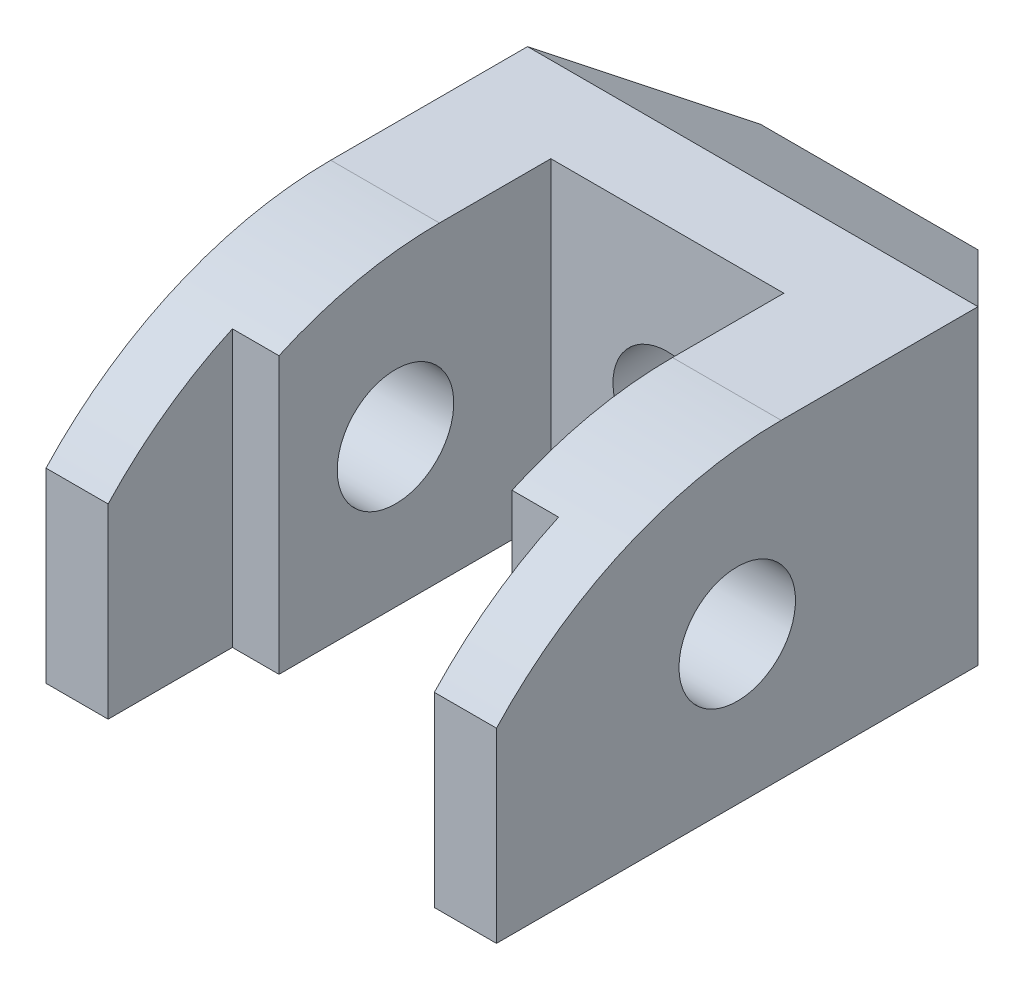
ISO-10303-21;
HEADER;
FILE_DESCRIPTION(('STEP AP214'),'2;1');
FILE_NAME('part.step','',(''),(''),'','','');
FILE_SCHEMA(('AUTOMOTIVE_DESIGN { 1 0 10303 214 1 1 1 1 }'));
ENDSEC;
DATA;
#1=APPLICATION_CONTEXT('core data for automotive mechanical design processes');
#2=APPLICATION_PROTOCOL_DEFINITION('international standard','automotive_design',2000,#1);
#3=PRODUCT_CONTEXT('',#1,'mechanical');
#4=PRODUCT('Part','Part','',(#3));
#5=PRODUCT_RELATED_PRODUCT_CATEGORY('part','',(#4));
#6=PRODUCT_DEFINITION_FORMATION('','',#4);
#7=PRODUCT_DEFINITION_CONTEXT('part definition',#1,'design');
#8=PRODUCT_DEFINITION('design','',#6,#7);
#9=PRODUCT_DEFINITION_SHAPE('','',#8);
#10=(LENGTH_UNIT() NAMED_UNIT(*) SI_UNIT(.MILLI.,.METRE.));
#11=(NAMED_UNIT(*) PLANE_ANGLE_UNIT() SI_UNIT($,.RADIAN.));
#12=(NAMED_UNIT(*) SI_UNIT($,.STERADIAN.) SOLID_ANGLE_UNIT());
#13=UNCERTAINTY_MEASURE_WITH_UNIT(LENGTH_MEASURE(1.E-05),#10,'distance_accuracy_value','');
#14=(GEOMETRIC_REPRESENTATION_CONTEXT(3) GLOBAL_UNCERTAINTY_ASSIGNED_CONTEXT((#13)) GLOBAL_UNIT_ASSIGNED_CONTEXT((#10,
#11,#12)) REPRESENTATION_CONTEXT('',''));
#15=CARTESIAN_POINT('',(0.,0.,0.));
#16=DIRECTION('',(0.,0.,1.));
#17=DIRECTION('',(1.,0.,0.));
#18=AXIS2_PLACEMENT_3D('',#15,#16,#17);
#19=CARTESIAN_POINT('',(29.,-29.,-5.66060555964671));
#20=DIRECTION('',(-1.,0.,0.));
#21=DIRECTION('',(0.,0.,1.));
#22=AXIS2_PLACEMENT_3D('',#19,#20,#21);
#23=CYLINDRICAL_SURFACE('',#22,50.);
#24=DIRECTION('',(-1.,0.,0.));
#25=VECTOR('',#24,1.);
#26=CARTESIAN_POINT('',(29.,5.,31.));
#27=LINE('',#26,#25);
#28=CARTESIAN_POINT('',(-21.,4.99999999999999,31.));
#29=VERTEX_POINT('',#28);
#30=CARTESIAN_POINT('',(-29.,5.,31.));
#31=VERTEX_POINT('',#30);
#32=EDGE_CURVE('E196',#29,#31,#27,.T.);
#33=ORIENTED_EDGE('',*,*,#32,.F.);
#34=CARTESIAN_POINT('',(-21.,-29.,-5.66060555964671));
#35=DIRECTION('',(-1.,0.,0.));
#36=DIRECTION('',(0.,0.,1.));
#37=AXIS2_PLACEMENT_3D('',#34,#35,#36);
#38=CIRCLE('',#37,50.);
#39=CARTESIAN_POINT('',(-21.,16.5317403347236,15.));
#40=VERTEX_POINT('',#39);
#41=EDGE_CURVE('E166',#29,#40,#38,.T.);
#42=ORIENTED_EDGE('',*,*,#41,.T.);
#43=DIRECTION('',(-1.,0.,0.));
#44=VECTOR('',#43,1.);
#45=CARTESIAN_POINT('',(29.,16.5317403347236,15.));
#46=LINE('',#45,#44);
#47=CARTESIAN_POINT('',(-15.,16.5317403347236,15.));
#48=VERTEX_POINT('',#47);
#49=EDGE_CURVE('E237',#40,#48,#46,.F.);
#50=ORIENTED_EDGE('',*,*,#49,.T.);
#51=CARTESIAN_POINT('',(-15.,-29.,-5.66060555964671));
#52=DIRECTION('',(-1.,0.,0.));
#53=DIRECTION('',(0.,0.,1.));
#54=AXIS2_PLACEMENT_3D('',#51,#52,#53);
#55=CIRCLE('',#54,50.);
#56=CARTESIAN_POINT('',(-15.,21.,-5.66060555964671));
#57=VERTEX_POINT('',#56);
#58=EDGE_CURVE('E224',#48,#57,#55,.T.);
#59=ORIENTED_EDGE('',*,*,#58,.T.);
#60=DIRECTION('',(-1.,0.,0.));
#61=VECTOR('',#60,1.);
#62=CARTESIAN_POINT('',(29.,21.,-5.66060555964671));
#63=LINE('',#62,#61);
#64=CARTESIAN_POINT('',(-29.,21.,-5.66060555964671));
#65=VERTEX_POINT('',#64);
#66=EDGE_CURVE('E292',#57,#65,#63,.T.);
#67=ORIENTED_EDGE('',*,*,#66,.T.);
#68=CARTESIAN_POINT('',(-29.,-29.,-5.66060555964671));
#69=DIRECTION('',(1.,0.,0.));
#70=DIRECTION('',(0.,0.,-1.));
#71=AXIS2_PLACEMENT_3D('',#68,#69,#70);
#72=CIRCLE('',#71,50.);
#73=EDGE_CURVE('E273',#65,#31,#72,.T.);
#74=ORIENTED_EDGE('',*,*,#73,.T.);
#75=EDGE_LOOP('',(#33,#42,#50,#59,#67,#74));
#76=FACE_BOUND('',#75,.T.);
#77=ADVANCED_FACE('F42',(#76),#23,.T.);
#78=CARTESIAN_POINT('',(29.,5.,31.));
#79=DIRECTION('',(0.,0.,-1.));
#80=DIRECTION('',(-1.,0.,0.));
#81=AXIS2_PLACEMENT_3D('',#78,#79,#80);
#82=PLANE('',#81);
#83=DIRECTION('',(-1.,0.,0.));
#84=VECTOR('',#83,1.);
#85=CARTESIAN_POINT('',(29.,-19.,31.));
#86=LINE('',#85,#84);
#87=CARTESIAN_POINT('',(-21.,-19.,31.));
#88=VERTEX_POINT('',#87);
#89=CARTESIAN_POINT('',(-29.,-19.,31.));
#90=VERTEX_POINT('',#89);
#91=EDGE_CURVE('E177',#88,#90,#86,.T.);
#92=ORIENTED_EDGE('',*,*,#91,.F.);
#93=DIRECTION('',(0.,1.,0.));
#94=VECTOR('',#93,1.);
#95=CARTESIAN_POINT('',(-21.,-19.,31.));
#96=LINE('',#95,#94);
#97=EDGE_CURVE('E159',#88,#29,#96,.T.);
#98=ORIENTED_EDGE('',*,*,#97,.T.);
#99=ORIENTED_EDGE('',*,*,#32,.T.);
#100=DIRECTION('',(0.,-1.,0.));
#101=VECTOR('',#100,1.);
#102=CARTESIAN_POINT('',(-29.,5.,31.));
#103=LINE('',#102,#101);
#104=EDGE_CURVE('E187',#31,#90,#103,.T.);
#105=ORIENTED_EDGE('',*,*,#104,.T.);
#106=EDGE_LOOP('',(#92,#98,#99,#105));
#107=FACE_BOUND('',#106,.T.);
#108=ADVANCED_FACE('F185',(#107),#82,.F.);
#109=CARTESIAN_POINT('',(29.,0.,0.));
#110=DIRECTION('',(-1.,0.,0.));
#111=DIRECTION('',(0.,0.,1.));
#112=AXIS2_PLACEMENT_3D('',#109,#110,#111);
#113=CYLINDRICAL_SURFACE('',#112,7.5);
#114=CARTESIAN_POINT('',(-15.,0.,0.));
#115=DIRECTION('',(-1.,0.,0.));
#116=DIRECTION('',(0.,0.,1.));
#117=AXIS2_PLACEMENT_3D('',#114,#115,#116);
#118=CIRCLE('',#117,7.5);
#119=CARTESIAN_POINT('',(-15.,0.,7.5));
#120=VERTEX_POINT('',#119);
#121=EDGE_CURVE('E46',#120,#120,#118,.T.);
#122=CARTESIAN_POINT('',(-29.,0.,0.));
#123=DIRECTION('',(1.,0.,0.));
#124=DIRECTION('',(0.,0.,-1.));
#125=AXIS2_PLACEMENT_3D('',#122,#123,#124);
#126=CIRCLE('',#125,7.5);
#127=CARTESIAN_POINT('',(-29.,0.,7.5));
#128=VERTEX_POINT('',#127);
#129=EDGE_CURVE('E268',#128,#128,#126,.T.);
#130=CARTESIAN_POINT('',(-15.,0.,7.5));
#131=CARTESIAN_POINT('',(-15.1458333333333,0.,7.5));
#132=CARTESIAN_POINT('',(-15.2916666666667,0.,7.5));
#133=CARTESIAN_POINT('',(-15.5833333333333,0.,7.5));
#134=CARTESIAN_POINT('',(-15.7291666666667,0.,7.5));
#135=CARTESIAN_POINT('',(-16.0208333333333,0.,7.5));
#136=CARTESIAN_POINT('',(-16.1666666666667,0.,7.5));
#137=CARTESIAN_POINT('',(-16.4583333333333,0.,7.5));
#138=CARTESIAN_POINT('',(-16.6041666666667,0.,7.5));
#139=CARTESIAN_POINT('',(-16.8958333333333,0.,7.5));
#140=CARTESIAN_POINT('',(-17.0416666666667,0.,7.5));
#141=CARTESIAN_POINT('',(-17.3333333333333,0.,7.5));
#142=CARTESIAN_POINT('',(-17.4791666666667,0.,7.5));
#143=CARTESIAN_POINT('',(-17.7708333333333,0.,7.5));
#144=CARTESIAN_POINT('',(-17.9166666666667,0.,7.5));
#145=CARTESIAN_POINT('',(-18.2083333333333,0.,7.5));
#146=CARTESIAN_POINT('',(-18.3541666666667,0.,7.5));
#147=CARTESIAN_POINT('',(-18.6458333333333,0.,7.5));
#148=CARTESIAN_POINT('',(-18.7916666666667,0.,7.5));
#149=CARTESIAN_POINT('',(-19.0833333333333,0.,7.5));
#150=CARTESIAN_POINT('',(-19.2291666666667,0.,7.5));
#151=CARTESIAN_POINT('',(-19.5208333333333,0.,7.5));
#152=CARTESIAN_POINT('',(-19.6666666666667,0.,7.5));
#153=CARTESIAN_POINT('',(-19.9583333333333,0.,7.5));
#154=CARTESIAN_POINT('',(-20.1041666666667,0.,7.5));
#155=CARTESIAN_POINT('',(-20.3958333333333,0.,7.5));
#156=CARTESIAN_POINT('',(-20.5416666666667,0.,7.5));
#157=CARTESIAN_POINT('',(-20.8333333333333,0.,7.5));
#158=CARTESIAN_POINT('',(-20.9791666666667,0.,7.5));
#159=CARTESIAN_POINT('',(-21.2708333333333,0.,7.5));
#160=CARTESIAN_POINT('',(-21.4166666666667,0.,7.5));
#161=CARTESIAN_POINT('',(-21.7083333333333,0.,7.5));
#162=CARTESIAN_POINT('',(-21.8541666666667,0.,7.5));
#163=CARTESIAN_POINT('',(-22.1458333333333,0.,7.5));
#164=CARTESIAN_POINT('',(-22.2916666666667,0.,7.5));
#165=CARTESIAN_POINT('',(-22.5833333333333,0.,7.5));
#166=CARTESIAN_POINT('',(-22.7291666666667,0.,7.5));
#167=CARTESIAN_POINT('',(-23.0208333333333,0.,7.5));
#168=CARTESIAN_POINT('',(-23.1666666666667,0.,7.5));
#169=CARTESIAN_POINT('',(-23.4583333333333,0.,7.5));
#170=CARTESIAN_POINT('',(-23.6041666666667,0.,7.5));
#171=CARTESIAN_POINT('',(-23.8958333333333,0.,7.5));
#172=CARTESIAN_POINT('',(-24.0416666666667,0.,7.5));
#173=CARTESIAN_POINT('',(-24.3333333333333,0.,7.5));
#174=CARTESIAN_POINT('',(-24.4791666666667,0.,7.5));
#175=CARTESIAN_POINT('',(-24.7708333333333,0.,7.5));
#176=CARTESIAN_POINT('',(-24.9166666666667,0.,7.5));
#177=CARTESIAN_POINT('',(-25.2083333333333,0.,7.5));
#178=CARTESIAN_POINT('',(-25.3541666666667,0.,7.5));
#179=CARTESIAN_POINT('',(-25.6458333333333,0.,7.5));
#180=CARTESIAN_POINT('',(-25.7916666666667,0.,7.5));
#181=CARTESIAN_POINT('',(-26.0833333333333,0.,7.5));
#182=CARTESIAN_POINT('',(-26.2291666666667,0.,7.5));
#183=CARTESIAN_POINT('',(-26.5208333333333,0.,7.5));
#184=CARTESIAN_POINT('',(-26.6666666666667,0.,7.5));
#185=CARTESIAN_POINT('',(-26.9583333333333,0.,7.5));
#186=CARTESIAN_POINT('',(-27.1041666666667,0.,7.5));
#187=CARTESIAN_POINT('',(-27.3958333333333,0.,7.5));
#188=CARTESIAN_POINT('',(-27.5416666666667,0.,7.5));
#189=CARTESIAN_POINT('',(-27.8333333333333,0.,7.5));
#190=CARTESIAN_POINT('',(-27.9791666666667,0.,7.5));
#191=CARTESIAN_POINT('',(-28.2708333333333,0.,7.5));
#192=CARTESIAN_POINT('',(-28.4166666666667,0.,7.5));
#193=CARTESIAN_POINT('',(-28.7083333333333,0.,7.5));
#194=CARTESIAN_POINT('',(-28.8541666666667,0.,7.5));
#195=CARTESIAN_POINT('',(-29.,0.,7.5));
#196=B_SPLINE_CURVE_WITH_KNOTS('',3,(#130,#131,#132,#133,#134,#135,#136,#137,#138,#139,#140,
#141,#142,#143,#144,#145,#146,#147,#148,#149,#150,#151,#152,#153,#154,#155,#156,#157,#158,#159,
#160,#161,#162,#163,#164,#165,#166,#167,#168,#169,#170,#171,#172,#173,#174,#175,#176,#177,#178,
#179,#180,#181,#182,#183,#184,#185,#186,#187,#188,#189,#190,#191,#192,#193,#194,#195),
.UNSPECIFIED.,.F.,.F.,(4,2,2,2,2,2,2,2,2,2,2,2,2,2,2,2,2,2,2,2,2,2,2,2,2,2,2,2,2,2,2,2,4),(0.,
0.4375,0.875000000000001,1.3125,1.75,2.1875,2.625,3.0625,3.5,3.9375,4.375,4.8125,5.25,
5.68750000000001,6.12500000000001,6.56250000000001,7.00000000000001,7.43750000000001,
7.87500000000001,8.31250000000001,8.75000000000001,9.18750000000001,9.62500000000001,10.0625,
10.5,10.9375,11.375,11.8125,12.25,12.6875,13.125,13.5625,14.),.UNSPECIFIED.);
#197=EDGE_CURVE('BSEAM432',#120,#128,#196,.T.);
#198=ORIENTED_EDGE('',*,*,#121,.F.);
#199=ORIENTED_EDGE('',*,*,#129,.F.);
#200=ORIENTED_EDGE('',*,*,#197,.T.);
#201=ORIENTED_EDGE('',*,*,#197,.F.);
#202=EDGE_LOOP('',(#198,#200,#199,#201));
#203=FACE_BOUND('',#202,.T.);
#204=ADVANCED_FACE('F432',(#203),#113,.F.);
#205=CARTESIAN_POINT('',(29.,-29.,-5.66060555964671));
#206=DIRECTION('',(1.,0.,0.));
#207=DIRECTION('',(0.,0.,-1.));
#208=AXIS2_PLACEMENT_3D('',#205,#206,#207);
#209=PLANE('',#208);
#210=DIRECTION('',(0.,1.,0.));
#211=VECTOR('',#210,1.);
#212=CARTESIAN_POINT('',(29.,-19.,-31.));
#213=LINE('',#212,#211);
#214=CARTESIAN_POINT('',(29.,-19.,-31.));
#215=VERTEX_POINT('',#214);
#216=CARTESIAN_POINT('',(29.,21.,-31.));
#217=VERTEX_POINT('',#216);
#218=EDGE_CURVE('E255',#215,#217,#213,.T.);
#219=ORIENTED_EDGE('',*,*,#218,.T.);
#220=DIRECTION('',(0.,0.,1.));
#221=VECTOR('',#220,1.);
#222=CARTESIAN_POINT('',(29.,21.,-31.));
#223=LINE('',#222,#221);
#224=CARTESIAN_POINT('',(29.,21.,-5.66060555964671));
#225=VERTEX_POINT('',#224);
#226=EDGE_CURVE('E289',#217,#225,#223,.T.);
#227=ORIENTED_EDGE('',*,*,#226,.T.);
#228=CARTESIAN_POINT('',(29.,-29.,-5.66060555964671));
#229=DIRECTION('',(1.,0.,0.));
#230=DIRECTION('',(0.,0.,-1.));
#231=AXIS2_PLACEMENT_3D('',#228,#229,#230);
#232=CIRCLE('',#231,50.);
#233=CARTESIAN_POINT('',(29.,5.,31.));
#234=VERTEX_POINT('',#233);
#235=EDGE_CURVE('E277',#225,#234,#232,.T.);
#236=ORIENTED_EDGE('',*,*,#235,.T.);
#237=DIRECTION('',(0.,-1.,0.));
#238=VECTOR('',#237,1.);
#239=CARTESIAN_POINT('',(29.,5.,31.));
#240=LINE('',#239,#238);
#241=CARTESIAN_POINT('',(29.,-19.,31.));
#242=VERTEX_POINT('',#241);
#243=EDGE_CURVE('E281',#234,#242,#240,.T.);
#244=ORIENTED_EDGE('',*,*,#243,.T.);
#245=DIRECTION('',(0.,0.,-1.));
#246=VECTOR('',#245,1.);
#247=CARTESIAN_POINT('',(29.,-19.,31.));
#248=LINE('',#247,#246);
#249=EDGE_CURVE('E285',#242,#215,#248,.T.);
#250=ORIENTED_EDGE('',*,*,#249,.T.);
#251=EDGE_LOOP('',(#219,#227,#236,#244,#250));
#252=FACE_BOUND('',#251,.T.);
#253=CARTESIAN_POINT('',(29.,0.,0.));
#254=DIRECTION('',(1.,0.,0.));
#255=DIRECTION('',(0.,0.,-1.));
#256=AXIS2_PLACEMENT_3D('',#253,#254,#255);
#257=CIRCLE('',#256,7.5);
#258=CARTESIAN_POINT('',(29.,0.,7.5));
#259=VERTEX_POINT('',#258);
#260=EDGE_CURVE('E269',#259,#259,#257,.T.);
#261=ORIENTED_EDGE('',*,*,#260,.F.);
#262=EDGE_LOOP('',(#261));
#263=FACE_BOUND('',#262,.T.);
#264=ADVANCED_FACE('F335',(#252,#263),#209,.T.);
#265=CARTESIAN_POINT('',(-29.,-29.,-5.66060555964671));
#266=DIRECTION('',(1.,0.,0.));
#267=DIRECTION('',(0.,0.,-1.));
#268=AXIS2_PLACEMENT_3D('',#265,#266,#267);
#269=PLANE('',#268);
#270=DIRECTION('',(0.,0.,1.));
#271=VECTOR('',#270,1.);
#272=CARTESIAN_POINT('',(-29.,21.,-31.));
#273=LINE('',#272,#271);
#274=CARTESIAN_POINT('',(-29.,21.,-31.));
#275=VERTEX_POINT('',#274);
#276=EDGE_CURVE('E282',#275,#65,#273,.T.);
#277=ORIENTED_EDGE('',*,*,#276,.F.);
#278=DIRECTION('',(0.,1.,0.));
#279=VECTOR('',#278,1.);
#280=CARTESIAN_POINT('',(-29.,-19.,-31.));
#281=LINE('',#280,#279);
#282=CARTESIAN_POINT('',(-29.,-19.,-31.));
#283=VERTEX_POINT('',#282);
#284=EDGE_CURVE('E252',#283,#275,#281,.T.);
#285=ORIENTED_EDGE('',*,*,#284,.F.);
#286=DIRECTION('',(0.,0.,-1.));
#287=VECTOR('',#286,1.);
#288=CARTESIAN_POINT('',(-29.,-19.,31.));
#289=LINE('',#288,#287);
#290=EDGE_CURVE('E298',#90,#283,#289,.T.);
#291=ORIENTED_EDGE('',*,*,#290,.F.);
#292=ORIENTED_EDGE('',*,*,#104,.F.);
#293=ORIENTED_EDGE('',*,*,#73,.F.);
#294=EDGE_LOOP('',(#277,#285,#291,#292,#293));
#295=FACE_BOUND('',#294,.T.);
#296=ORIENTED_EDGE('',*,*,#129,.T.);
#297=EDGE_LOOP('',(#296));
#298=FACE_BOUND('',#297,.T.);
#299=ADVANCED_FACE('F328',(#295,#298),#269,.F.);
#300=CARTESIAN_POINT('',(15.,21.,-5.66060555964671));
#301=VERTEX_POINT('',#300);
#302=EDGE_CURVE('E304',#225,#301,#63,.T.);
#303=ORIENTED_EDGE('',*,*,#302,.T.);
#304=CARTESIAN_POINT('',(15.,-29.,-5.66060555964671));
#305=DIRECTION('',(1.,0.,0.));
#306=DIRECTION('',(0.,0.,-1.));
#307=AXIS2_PLACEMENT_3D('',#304,#305,#306);
#308=CIRCLE('',#307,50.);
#309=CARTESIAN_POINT('',(15.,16.5317403347236,15.));
#310=VERTEX_POINT('',#309);
#311=EDGE_CURVE('E60',#301,#310,#308,.T.);
#312=ORIENTED_EDGE('',*,*,#311,.T.);
#313=DIRECTION('',(-1.,0.,0.));
#314=VECTOR('',#313,1.);
#315=CARTESIAN_POINT('',(29.,16.5317403347236,15.));
#316=LINE('',#315,#314);
#317=CARTESIAN_POINT('',(21.,16.5317403347236,15.));
#318=VERTEX_POINT('',#317);
#319=EDGE_CURVE('E234',#310,#318,#316,.F.);
#320=ORIENTED_EDGE('',*,*,#319,.T.);
#321=CARTESIAN_POINT('',(21.,-29.,-5.66060555964671));
#322=DIRECTION('',(1.,0.,0.));
#323=DIRECTION('',(0.,0.,-1.));
#324=AXIS2_PLACEMENT_3D('',#321,#322,#323);
#325=CIRCLE('',#324,50.);
#326=CARTESIAN_POINT('',(21.,4.99999999999999,31.));
#327=VERTEX_POINT('',#326);
#328=EDGE_CURVE('E230',#318,#327,#325,.T.);
#329=ORIENTED_EDGE('',*,*,#328,.T.);
#330=EDGE_CURVE('E202',#234,#327,#27,.T.);
#331=ORIENTED_EDGE('',*,*,#330,.F.);
#332=ORIENTED_EDGE('',*,*,#235,.F.);
#333=EDGE_LOOP('',(#303,#312,#320,#329,#331,#332));
#334=FACE_BOUND('',#333,.T.);
#335=ADVANCED_FACE('F44',(#334),#23,.T.);
#336=ORIENTED_EDGE('',*,*,#330,.T.);
#337=DIRECTION('',(0.,1.,0.));
#338=VECTOR('',#337,1.);
#339=CARTESIAN_POINT('',(21.,-19.,31.));
#340=LINE('',#339,#338);
#341=CARTESIAN_POINT('',(21.,-19.,31.));
#342=VERTEX_POINT('',#341);
#343=EDGE_CURVE('E171',#342,#327,#340,.T.);
#344=ORIENTED_EDGE('',*,*,#343,.F.);
#345=EDGE_CURVE('E190',#242,#342,#86,.T.);
#346=ORIENTED_EDGE('',*,*,#345,.F.);
#347=ORIENTED_EDGE('',*,*,#243,.F.);
#348=EDGE_LOOP('',(#336,#344,#346,#347));
#349=FACE_BOUND('',#348,.T.);
#350=ADVANCED_FACE('F342',(#349),#82,.F.);
#351=CARTESIAN_POINT('',(29.,-19.,31.));
#352=DIRECTION('',(0.,1.,0.));
#353=DIRECTION('',(0.,0.,1.));
#354=AXIS2_PLACEMENT_3D('',#351,#352,#353);
#355=PLANE('',#354);
#356=DIRECTION('',(-1.,0.,0.));
#357=VECTOR('',#356,1.);
#358=CARTESIAN_POINT('',(-21.,-19.,15.));
#359=LINE('',#358,#357);
#360=CARTESIAN_POINT('',(-15.,-19.,15.));
#361=VERTEX_POINT('',#360);
#362=CARTESIAN_POINT('',(-21.,-19.,15.));
#363=VERTEX_POINT('',#362);
#364=EDGE_CURVE('E172',#361,#363,#359,.T.);
#365=ORIENTED_EDGE('',*,*,#364,.T.);
#366=DIRECTION('',(0.,0.,1.));
#367=VECTOR('',#366,1.);
#368=CARTESIAN_POINT('',(-21.,-19.,31.));
#369=LINE('',#368,#367);
#370=EDGE_CURVE('E163',#363,#88,#369,.T.);
#371=ORIENTED_EDGE('',*,*,#370,.T.);
#372=ORIENTED_EDGE('',*,*,#91,.T.);
#373=ORIENTED_EDGE('',*,*,#290,.T.);
#374=DIRECTION('',(-1.,0.,0.));
#375=VECTOR('',#374,1.);
#376=CARTESIAN_POINT('',(29.,-19.,-31.));
#377=LINE('',#376,#375);
#378=EDGE_CURVE('E191',#215,#283,#377,.T.);
#379=ORIENTED_EDGE('',*,*,#378,.F.);
#380=ORIENTED_EDGE('',*,*,#249,.F.);
#381=ORIENTED_EDGE('',*,*,#345,.T.);
#382=DIRECTION('',(0.,0.,-1.));
#383=VECTOR('',#382,1.);
#384=CARTESIAN_POINT('',(21.,-19.,15.));
#385=LINE('',#384,#383);
#386=CARTESIAN_POINT('',(21.,-19.,15.));
#387=VERTEX_POINT('',#386);
#388=EDGE_CURVE('E182',#342,#387,#385,.T.);
#389=ORIENTED_EDGE('',*,*,#388,.T.);
#390=DIRECTION('',(-1.,0.,0.));
#391=VECTOR('',#390,1.);
#392=CARTESIAN_POINT('',(15.,-19.,15.));
#393=LINE('',#392,#391);
#394=CARTESIAN_POINT('',(15.,-19.,15.));
#395=VERTEX_POINT('',#394);
#396=EDGE_CURVE('E388',#387,#395,#393,.T.);
#397=ORIENTED_EDGE('',*,*,#396,.T.);
#398=DIRECTION('',(0.,0.,-1.));
#399=VECTOR('',#398,1.);
#400=CARTESIAN_POINT('',(15.,-19.,-20.));
#401=LINE('',#400,#399);
#402=CARTESIAN_POINT('',(15.,-19.,-20.));
#403=VERTEX_POINT('',#402);
#404=EDGE_CURVE('E384',#395,#403,#401,.T.);
#405=ORIENTED_EDGE('',*,*,#404,.T.);
#406=DIRECTION('',(-1.,0.,0.));
#407=VECTOR('',#406,1.);
#408=CARTESIAN_POINT('',(-15.,-19.,-20.));
#409=LINE('',#408,#407);
#410=CARTESIAN_POINT('',(-15.,-19.,-20.));
#411=VERTEX_POINT('',#410);
#412=EDGE_CURVE('E380',#403,#411,#409,.T.);
#413=ORIENTED_EDGE('',*,*,#412,.T.);
#414=DIRECTION('',(0.,0.,1.));
#415=VECTOR('',#414,1.);
#416=CARTESIAN_POINT('',(-15.,-19.,15.));
#417=LINE('',#416,#415);
#418=EDGE_CURVE('E377',#411,#361,#417,.T.);
#419=ORIENTED_EDGE('',*,*,#418,.T.);
#420=EDGE_LOOP('',(#365,#371,#372,#373,#379,#380,#381,#389,#397,#405,#413,#419));
#421=FACE_BOUND('',#420,.T.);
#422=ADVANCED_FACE('F175',(#421),#355,.F.);
#423=CARTESIAN_POINT('',(29.,-19.,-31.));
#424=DIRECTION('',(0.,0.866025403784438,0.500000000000001));
#425=DIRECTION('',(0.,-0.500000000000001,0.866025403784438));
#426=AXIS2_PLACEMENT_3D('',#423,#424,#425);
#427=PLANE('',#426);
#428=ORIENTED_EDGE('',*,*,#378,.T.);
#429=DIRECTION('',(0.654653670707978,0.377964473009228,-0.654653670707976));
#430=VECTOR('',#429,1.);
#431=CARTESIAN_POINT('',(-4.14285714285709,-4.64872188014355,-55.8571428571429));
#432=LINE('',#431,#430);
#433=CARTESIAN_POINT('',(-14.,-10.3397459621556,-46.));
#434=VERTEX_POINT('',#433);
#435=EDGE_CURVE('E264',#283,#434,#432,.T.);
#436=ORIENTED_EDGE('',*,*,#435,.T.);
#437=DIRECTION('',(-1.,0.,0.));
#438=VECTOR('',#437,1.);
#439=CARTESIAN_POINT('',(29.,-10.3397459621556,-46.));
#440=LINE('',#439,#438);
#441=CARTESIAN_POINT('',(14.0000000000002,-10.3397459621556,-46.));
#442=VERTEX_POINT('',#441);
#443=EDGE_CURVE('E198',#442,#434,#440,.T.);
#444=ORIENTED_EDGE('',*,*,#443,.F.);
#445=DIRECTION('',(0.654653670707973,-0.37796447300923,0.65465367070798));
#446=VECTOR('',#445,1.);
#447=CARTESIAN_POINT('',(29.,-19.,-31.));
#448=LINE('',#447,#446);
#449=EDGE_CURVE('E251',#442,#215,#448,.T.);
#450=ORIENTED_EDGE('',*,*,#449,.T.);
#451=EDGE_LOOP('',(#428,#436,#444,#450));
#452=FACE_BOUND('',#451,.T.);
#453=ADVANCED_FACE('F321',(#452),#427,.F.);
#454=CARTESIAN_POINT('',(29.,-10.3397459621556,-46.));
#455=DIRECTION('',(0.,0.,1.));
#456=DIRECTION('',(0.,-1.,0.));
#457=AXIS2_PLACEMENT_3D('',#454,#455,#456);
#458=PLANE('',#457);
#459=CARTESIAN_POINT('',(0.,0.,-46.));
#460=DIRECTION('',(0.,0.,-1.));
#461=DIRECTION('',(0.,1.,0.));
#462=AXIS2_PLACEMENT_3D('',#459,#460,#461);
#463=CIRCLE('',#462,7.);
#464=CARTESIAN_POINT('',(0.,6.99999999999999,-46.));
#465=VERTEX_POINT('',#464);
#466=EDGE_CURVE('E243',#465,#465,#463,.T.);
#467=ORIENTED_EDGE('',*,*,#466,.F.);
#468=EDGE_LOOP('',(#467));
#469=FACE_BOUND('',#468,.T.);
#470=ORIENTED_EDGE('',*,*,#443,.T.);
#471=DIRECTION('',(0.,1.,0.));
#472=VECTOR('',#471,1.);
#473=CARTESIAN_POINT('',(-14.,-19.,-46.));
#474=LINE('',#473,#472);
#475=CARTESIAN_POINT('',(-14.,12.3397459621556,-46.));
#476=VERTEX_POINT('',#475);
#477=EDGE_CURVE('E247',#434,#476,#474,.T.);
#478=ORIENTED_EDGE('',*,*,#477,.T.);
#479=DIRECTION('',(-1.,0.,0.));
#480=VECTOR('',#479,1.);
#481=CARTESIAN_POINT('',(29.,12.3397459621556,-46.));
#482=LINE('',#481,#480);
#483=CARTESIAN_POINT('',(14.0000000000002,12.3397459621556,-46.));
#484=VERTEX_POINT('',#483);
#485=EDGE_CURVE('E311',#484,#476,#482,.T.);
#486=ORIENTED_EDGE('',*,*,#485,.F.);
#487=DIRECTION('',(0.,1.,0.));
#488=VECTOR('',#487,1.);
#489=CARTESIAN_POINT('',(14.0000000000002,-19.,-46.));
#490=LINE('',#489,#488);
#491=EDGE_CURVE('E68',#442,#484,#490,.T.);
#492=ORIENTED_EDGE('',*,*,#491,.F.);
#493=EDGE_LOOP('',(#470,#478,#486,#492));
#494=FACE_BOUND('',#493,.T.);
#495=ADVANCED_FACE('F318',(#469,#494),#458,.F.);
#496=CARTESIAN_POINT('',(29.,12.3397459621556,-46.));
#497=DIRECTION('',(0.,-0.866025403784438,0.500000000000001));
#498=DIRECTION('',(0.,-0.500000000000001,-0.866025403784438));
#499=AXIS2_PLACEMENT_3D('',#496,#497,#498);
#500=PLANE('',#499);
#501=ORIENTED_EDGE('',*,*,#485,.T.);
#502=DIRECTION('',(-0.654653670707978,0.377964473009227,0.654653670707976));
#503=VECTOR('',#502,1.);
#504=CARTESIAN_POINT('',(4.4285714285715,1.70000528708962,-64.4285714285714));
#505=LINE('',#504,#503);
#506=EDGE_CURVE('E11',#476,#275,#505,.T.);
#507=ORIENTED_EDGE('',*,*,#506,.T.);
#508=DIRECTION('',(-1.,0.,0.));
#509=VECTOR('',#508,1.);
#510=CARTESIAN_POINT('',(29.,21.,-31.));
#511=LINE('',#510,#509);
#512=EDGE_CURVE('E307',#217,#275,#511,.T.);
#513=ORIENTED_EDGE('',*,*,#512,.F.);
#514=DIRECTION('',(-0.654653670707973,-0.37796447300923,-0.65465367070798));
#515=VECTOR('',#514,1.);
#516=CARTESIAN_POINT('',(20.4285714285714,16.051283406946,-39.5714285714287));
#517=LINE('',#516,#515);
#518=EDGE_CURVE('E52',#217,#484,#517,.T.);
#519=ORIENTED_EDGE('',*,*,#518,.T.);
#520=EDGE_LOOP('',(#501,#507,#513,#519));
#521=FACE_BOUND('',#520,.T.);
#522=ADVANCED_FACE('F419',(#521),#500,.F.);
#523=CARTESIAN_POINT('',(29.,21.,-31.));
#524=DIRECTION('',(0.,-1.,0.));
#525=DIRECTION('',(0.,0.,-1.));
#526=AXIS2_PLACEMENT_3D('',#523,#524,#525);
#527=PLANE('',#526);
#528=ORIENTED_EDGE('',*,*,#66,.F.);
#529=DIRECTION('',(0.,0.,1.));
#530=VECTOR('',#529,1.);
#531=CARTESIAN_POINT('',(-15.,21.,15.));
#532=LINE('',#531,#530);
#533=CARTESIAN_POINT('',(-15.,21.,-20.));
#534=VERTEX_POINT('',#533);
#535=EDGE_CURVE('E183',#534,#57,#532,.T.);
#536=ORIENTED_EDGE('',*,*,#535,.F.);
#537=DIRECTION('',(-1.,0.,0.));
#538=VECTOR('',#537,1.);
#539=CARTESIAN_POINT('',(-15.,21.,-20.));
#540=LINE('',#539,#538);
#541=CARTESIAN_POINT('',(15.,21.,-20.));
#542=VERTEX_POINT('',#541);
#543=EDGE_CURVE('E368',#542,#534,#540,.T.);
#544=ORIENTED_EDGE('',*,*,#543,.F.);
#545=DIRECTION('',(0.,0.,-1.));
#546=VECTOR('',#545,1.);
#547=CARTESIAN_POINT('',(15.,21.,-20.));
#548=LINE('',#547,#546);
#549=EDGE_CURVE('E372',#301,#542,#548,.T.);
#550=ORIENTED_EDGE('',*,*,#549,.F.);
#551=ORIENTED_EDGE('',*,*,#302,.F.);
#552=ORIENTED_EDGE('',*,*,#226,.F.);
#553=ORIENTED_EDGE('',*,*,#512,.T.);
#554=ORIENTED_EDGE('',*,*,#276,.T.);
#555=EDGE_LOOP('',(#528,#536,#544,#550,#551,#552,#553,#554));
#556=FACE_BOUND('',#555,.T.);
#557=ADVANCED_FACE('F415',(#556),#527,.F.);
#558=CARTESIAN_POINT('',(15.,0.,0.));
#559=DIRECTION('',(1.,0.,0.));
#560=DIRECTION('',(0.,0.,-1.));
#561=AXIS2_PLACEMENT_3D('',#558,#559,#560);
#562=CIRCLE('',#561,7.5);
#563=CARTESIAN_POINT('',(15.,0.,7.5));
#564=VERTEX_POINT('',#563);
#565=EDGE_CURVE('E211',#564,#564,#562,.T.);
#566=CARTESIAN_POINT('',(15.,0.,7.5));
#567=CARTESIAN_POINT('',(15.1458333333333,0.,7.5));
#568=CARTESIAN_POINT('',(15.2916666666667,0.,7.5));
#569=CARTESIAN_POINT('',(15.5833333333333,0.,7.5));
#570=CARTESIAN_POINT('',(15.7291666666667,0.,7.5));
#571=CARTESIAN_POINT('',(16.0208333333333,0.,7.5));
#572=CARTESIAN_POINT('',(16.1666666666667,0.,7.5));
#573=CARTESIAN_POINT('',(16.4583333333333,0.,7.5));
#574=CARTESIAN_POINT('',(16.6041666666667,0.,7.5));
#575=CARTESIAN_POINT('',(16.8958333333333,0.,7.5));
#576=CARTESIAN_POINT('',(17.0416666666667,0.,7.5));
#577=CARTESIAN_POINT('',(17.3333333333333,0.,7.5));
#578=CARTESIAN_POINT('',(17.4791666666667,0.,7.5));
#579=CARTESIAN_POINT('',(17.7708333333333,0.,7.5));
#580=CARTESIAN_POINT('',(17.9166666666667,0.,7.5));
#581=CARTESIAN_POINT('',(18.2083333333333,0.,7.5));
#582=CARTESIAN_POINT('',(18.3541666666667,0.,7.5));
#583=CARTESIAN_POINT('',(18.6458333333333,0.,7.5));
#584=CARTESIAN_POINT('',(18.7916666666667,0.,7.5));
#585=CARTESIAN_POINT('',(19.0833333333333,0.,7.5));
#586=CARTESIAN_POINT('',(19.2291666666667,0.,7.5));
#587=CARTESIAN_POINT('',(19.5208333333333,0.,7.5));
#588=CARTESIAN_POINT('',(19.6666666666667,0.,7.5));
#589=CARTESIAN_POINT('',(19.9583333333333,0.,7.5));
#590=CARTESIAN_POINT('',(20.1041666666667,0.,7.5));
#591=CARTESIAN_POINT('',(20.3958333333333,0.,7.5));
#592=CARTESIAN_POINT('',(20.5416666666667,0.,7.5));
#593=CARTESIAN_POINT('',(20.8333333333333,0.,7.5));
#594=CARTESIAN_POINT('',(20.9791666666667,0.,7.5));
#595=CARTESIAN_POINT('',(21.2708333333333,0.,7.5));
#596=CARTESIAN_POINT('',(21.4166666666667,0.,7.5));
#597=CARTESIAN_POINT('',(21.7083333333333,0.,7.5));
#598=CARTESIAN_POINT('',(21.8541666666667,0.,7.5));
#599=CARTESIAN_POINT('',(22.1458333333333,0.,7.5));
#600=CARTESIAN_POINT('',(22.2916666666667,0.,7.5));
#601=CARTESIAN_POINT('',(22.5833333333333,0.,7.5));
#602=CARTESIAN_POINT('',(22.7291666666667,0.,7.5));
#603=CARTESIAN_POINT('',(23.0208333333333,0.,7.5));
#604=CARTESIAN_POINT('',(23.1666666666667,0.,7.5));
#605=CARTESIAN_POINT('',(23.4583333333333,0.,7.5));
#606=CARTESIAN_POINT('',(23.6041666666667,0.,7.5));
#607=CARTESIAN_POINT('',(23.8958333333333,0.,7.5));
#608=CARTESIAN_POINT('',(24.0416666666667,0.,7.5));
#609=CARTESIAN_POINT('',(24.3333333333333,0.,7.5));
#610=CARTESIAN_POINT('',(24.4791666666667,0.,7.5));
#611=CARTESIAN_POINT('',(24.7708333333333,0.,7.5));
#612=CARTESIAN_POINT('',(24.9166666666667,0.,7.5));
#613=CARTESIAN_POINT('',(25.2083333333333,0.,7.5));
#614=CARTESIAN_POINT('',(25.3541666666667,0.,7.5));
#615=CARTESIAN_POINT('',(25.6458333333333,0.,7.5));
#616=CARTESIAN_POINT('',(25.7916666666667,0.,7.5));
#617=CARTESIAN_POINT('',(26.0833333333333,0.,7.5));
#618=CARTESIAN_POINT('',(26.2291666666667,0.,7.5));
#619=CARTESIAN_POINT('',(26.5208333333333,0.,7.5));
#620=CARTESIAN_POINT('',(26.6666666666667,0.,7.5));
#621=CARTESIAN_POINT('',(26.9583333333333,0.,7.5));
#622=CARTESIAN_POINT('',(27.1041666666667,0.,7.5));
#623=CARTESIAN_POINT('',(27.3958333333333,0.,7.5));
#624=CARTESIAN_POINT('',(27.5416666666667,0.,7.5));
#625=CARTESIAN_POINT('',(27.8333333333333,0.,7.5));
#626=CARTESIAN_POINT('',(27.9791666666667,0.,7.5));
#627=CARTESIAN_POINT('',(28.2708333333333,0.,7.5));
#628=CARTESIAN_POINT('',(28.4166666666667,0.,7.5));
#629=CARTESIAN_POINT('',(28.7083333333333,0.,7.5));
#630=CARTESIAN_POINT('',(28.8541666666667,0.,7.5));
#631=CARTESIAN_POINT('',(29.,0.,7.5));
#632=B_SPLINE_CURVE_WITH_KNOTS('',3,(#566,#567,#568,#569,#570,#571,#572,#573,#574,#575,#576,
#577,#578,#579,#580,#581,#582,#583,#584,#585,#586,#587,#588,#589,#590,#591,#592,#593,#594,#595,
#596,#597,#598,#599,#600,#601,#602,#603,#604,#605,#606,#607,#608,#609,#610,#611,#612,#613,#614,
#615,#616,#617,#618,#619,#620,#621,#622,#623,#624,#625,#626,#627,#628,#629,#630,#631),
.UNSPECIFIED.,.F.,.F.,(4,2,2,2,2,2,2,2,2,2,2,2,2,2,2,2,2,2,2,2,2,2,2,2,2,2,2,2,2,2,2,2,4),(0.,
0.4375,0.875000000000003,1.3125,1.75,2.1875,2.625,3.0625,3.5,3.9375,4.375,4.8125,5.25,5.6875,
6.125,6.5625,7.,7.4375,7.875,8.3125,8.75,9.1875,9.625,10.0625,10.5,10.9375,11.375,11.8125,12.25,
12.6875,13.125,13.5625,14.),.UNSPECIFIED.);
#633=EDGE_CURVE('BSEAM422',#564,#259,#632,.T.);
#634=ORIENTED_EDGE('',*,*,#565,.F.);
#635=ORIENTED_EDGE('',*,*,#260,.T.);
#636=ORIENTED_EDGE('',*,*,#633,.T.);
#637=ORIENTED_EDGE('',*,*,#633,.F.);
#638=EDGE_LOOP('',(#634,#636,#635,#637));
#639=FACE_BOUND('',#638,.T.);
#640=ADVANCED_FACE('F422',(#639),#113,.F.);
#641=CARTESIAN_POINT('',(14.0000000000002,-19.,-46.));
#642=DIRECTION('',(-0.707106781186551,0.,0.707106781186544));
#643=DIRECTION('',(0.707106781186544,0.,0.707106781186551));
#644=AXIS2_PLACEMENT_3D('',#641,#642,#643);
#645=PLANE('',#644);
#646=ORIENTED_EDGE('',*,*,#491,.T.);
#647=ORIENTED_EDGE('',*,*,#518,.F.);
#648=ORIENTED_EDGE('',*,*,#218,.F.);
#649=ORIENTED_EDGE('',*,*,#449,.F.);
#650=EDGE_LOOP('',(#646,#647,#648,#649));
#651=FACE_BOUND('',#650,.T.);
#652=ADVANCED_FACE('F420',(#651),#645,.F.);
#653=CARTESIAN_POINT('',(-29.,-19.,-31.));
#654=DIRECTION('',(0.707106781186546,0.,0.707106781186548));
#655=DIRECTION('',(0.707106781186549,0.,-0.707106781186547));
#656=AXIS2_PLACEMENT_3D('',#653,#654,#655);
#657=PLANE('',#656);
#658=ORIENTED_EDGE('',*,*,#284,.T.);
#659=ORIENTED_EDGE('',*,*,#506,.F.);
#660=ORIENTED_EDGE('',*,*,#477,.F.);
#661=ORIENTED_EDGE('',*,*,#435,.F.);
#662=EDGE_LOOP('',(#658,#659,#660,#661));
#663=FACE_BOUND('',#662,.T.);
#664=ADVANCED_FACE('F325',(#663),#657,.F.);
#665=CARTESIAN_POINT('',(0.,0.,31.));
#666=DIRECTION('',(0.,0.,-1.));
#667=DIRECTION('',(0.,1.,0.));
#668=AXIS2_PLACEMENT_3D('',#665,#666,#667);
#669=CYLINDRICAL_SURFACE('',#668,7.);
#670=CARTESIAN_POINT('',(0.,0.,-20.));
#671=DIRECTION('',(0.,0.,-1.));
#672=DIRECTION('',(0.,1.,0.));
#673=AXIS2_PLACEMENT_3D('',#670,#671,#672);
#674=CIRCLE('',#673,7.);
#675=CARTESIAN_POINT('',(0.,6.99999999999999,-20.));
#676=VERTEX_POINT('',#675);
#677=EDGE_CURVE('E208',#676,#676,#674,.F.);
#678=ORIENTED_EDGE('',*,*,#677,.T.);
#679=EDGE_LOOP('',(#678));
#680=FACE_BOUND('',#679,.T.);
#681=ORIENTED_EDGE('',*,*,#466,.T.);
#682=EDGE_LOOP('',(#681));
#683=FACE_BOUND('',#682,.T.);
#684=ADVANCED_FACE('F428',(#680,#683),#669,.F.);
#685=CARTESIAN_POINT('',(-21.,-19.,31.));
#686=DIRECTION('',(-1.,0.,0.));
#687=DIRECTION('',(0.,0.,1.));
#688=AXIS2_PLACEMENT_3D('',#685,#686,#687);
#689=PLANE('',#688);
#690=ORIENTED_EDGE('',*,*,#97,.F.);
#691=ORIENTED_EDGE('',*,*,#370,.F.);
#692=DIRECTION('',(0.,1.,0.));
#693=VECTOR('',#692,1.);
#694=CARTESIAN_POINT('',(-21.,-19.,15.));
#695=LINE('',#694,#693);
#696=EDGE_CURVE('E212',#363,#40,#695,.T.);
#697=ORIENTED_EDGE('',*,*,#696,.T.);
#698=ORIENTED_EDGE('',*,*,#41,.F.);
#699=EDGE_LOOP('',(#690,#691,#697,#698));
#700=FACE_BOUND('',#699,.T.);
#701=ADVANCED_FACE('F161',(#700),#689,.F.);
#702=CARTESIAN_POINT('',(-21.,-19.,15.));
#703=DIRECTION('',(0.,0.,-1.));
#704=DIRECTION('',(0.,1.,0.));
#705=AXIS2_PLACEMENT_3D('',#702,#703,#704);
#706=PLANE('',#705);
#707=ORIENTED_EDGE('',*,*,#696,.F.);
#708=ORIENTED_EDGE('',*,*,#364,.F.);
#709=DIRECTION('',(0.,1.,0.));
#710=VECTOR('',#709,1.);
#711=CARTESIAN_POINT('',(-15.,-19.,15.));
#712=LINE('',#711,#710);
#713=EDGE_CURVE('E360',#361,#48,#712,.T.);
#714=ORIENTED_EDGE('',*,*,#713,.T.);
#715=ORIENTED_EDGE('',*,*,#49,.F.);
#716=EDGE_LOOP('',(#707,#708,#714,#715));
#717=FACE_BOUND('',#716,.T.);
#718=ADVANCED_FACE('F409',(#717),#706,.F.);
#719=CARTESIAN_POINT('',(15.,-19.,15.));
#720=DIRECTION('',(0.,0.,-1.));
#721=DIRECTION('',(0.,1.,0.));
#722=AXIS2_PLACEMENT_3D('',#719,#720,#721);
#723=PLANE('',#722);
#724=DIRECTION('',(0.,1.,0.));
#725=VECTOR('',#724,1.);
#726=CARTESIAN_POINT('',(15.,-19.,15.));
#727=LINE('',#726,#725);
#728=EDGE_CURVE('E348',#395,#310,#727,.T.);
#729=ORIENTED_EDGE('',*,*,#728,.F.);
#730=ORIENTED_EDGE('',*,*,#396,.F.);
#731=DIRECTION('',(0.,1.,0.));
#732=VECTOR('',#731,1.);
#733=CARTESIAN_POINT('',(21.,-19.,15.));
#734=LINE('',#733,#732);
#735=EDGE_CURVE('E345',#387,#318,#734,.T.);
#736=ORIENTED_EDGE('',*,*,#735,.T.);
#737=ORIENTED_EDGE('',*,*,#319,.F.);
#738=EDGE_LOOP('',(#729,#730,#736,#737));
#739=FACE_BOUND('',#738,.T.);
#740=ADVANCED_FACE('F396',(#739),#723,.F.);
#741=CARTESIAN_POINT('',(21.,-19.,15.));
#742=DIRECTION('',(1.,0.,0.));
#743=DIRECTION('',(0.,0.,-1.));
#744=AXIS2_PLACEMENT_3D('',#741,#742,#743);
#745=PLANE('',#744);
#746=ORIENTED_EDGE('',*,*,#735,.F.);
#747=ORIENTED_EDGE('',*,*,#388,.F.);
#748=ORIENTED_EDGE('',*,*,#343,.T.);
#749=ORIENTED_EDGE('',*,*,#328,.F.);
#750=EDGE_LOOP('',(#746,#747,#748,#749));
#751=FACE_BOUND('',#750,.T.);
#752=ADVANCED_FACE('F394',(#751),#745,.F.);
#753=CARTESIAN_POINT('',(-15.,-19.,15.));
#754=DIRECTION('',(-1.,0.,0.));
#755=DIRECTION('',(0.,0.,1.));
#756=AXIS2_PLACEMENT_3D('',#753,#754,#755);
#757=PLANE('',#756);
#758=ORIENTED_EDGE('',*,*,#121,.T.);
#759=EDGE_LOOP('',(#758));
#760=FACE_BOUND('',#759,.T.);
#761=ORIENTED_EDGE('',*,*,#713,.F.);
#762=ORIENTED_EDGE('',*,*,#418,.F.);
#763=DIRECTION('',(0.,1.,0.));
#764=VECTOR('',#763,1.);
#765=CARTESIAN_POINT('',(-15.,-19.,-20.));
#766=LINE('',#765,#764);
#767=EDGE_CURVE('E357',#411,#534,#766,.T.);
#768=ORIENTED_EDGE('',*,*,#767,.T.);
#769=ORIENTED_EDGE('',*,*,#535,.T.);
#770=ORIENTED_EDGE('',*,*,#58,.F.);
#771=EDGE_LOOP('',(#761,#762,#768,#769,#770));
#772=FACE_BOUND('',#771,.T.);
#773=ADVANCED_FACE('F407',(#760,#772),#757,.F.);
#774=CARTESIAN_POINT('',(15.,-19.,-20.));
#775=DIRECTION('',(1.,0.,0.));
#776=DIRECTION('',(0.,0.,-1.));
#777=AXIS2_PLACEMENT_3D('',#774,#775,#776);
#778=PLANE('',#777);
#779=ORIENTED_EDGE('',*,*,#565,.T.);
#780=EDGE_LOOP('',(#779));
#781=FACE_BOUND('',#780,.T.);
#782=ORIENTED_EDGE('',*,*,#549,.T.);
#783=DIRECTION('',(0.,1.,0.));
#784=VECTOR('',#783,1.);
#785=CARTESIAN_POINT('',(15.,-19.,-20.));
#786=LINE('',#785,#784);
#787=EDGE_CURVE('E353',#403,#542,#786,.T.);
#788=ORIENTED_EDGE('',*,*,#787,.F.);
#789=ORIENTED_EDGE('',*,*,#404,.F.);
#790=ORIENTED_EDGE('',*,*,#728,.T.);
#791=ORIENTED_EDGE('',*,*,#311,.F.);
#792=EDGE_LOOP('',(#782,#788,#789,#790,#791));
#793=FACE_BOUND('',#792,.T.);
#794=ADVANCED_FACE('F398',(#781,#793),#778,.F.);
#795=CARTESIAN_POINT('',(-15.,-19.,-20.));
#796=DIRECTION('',(0.,0.,-1.));
#797=DIRECTION('',(0.,1.,0.));
#798=AXIS2_PLACEMENT_3D('',#795,#796,#797);
#799=PLANE('',#798);
#800=ORIENTED_EDGE('',*,*,#543,.T.);
#801=ORIENTED_EDGE('',*,*,#767,.F.);
#802=ORIENTED_EDGE('',*,*,#412,.F.);
#803=ORIENTED_EDGE('',*,*,#787,.T.);
#804=EDGE_LOOP('',(#800,#801,#802,#803));
#805=FACE_BOUND('',#804,.T.);
#806=ORIENTED_EDGE('',*,*,#677,.F.);
#807=EDGE_LOOP('',(#806));
#808=FACE_BOUND('',#807,.T.);
#809=ADVANCED_FACE('F402',(#805,#808),#799,.F.);
#810=CLOSED_SHELL('',(#77,#108,#204,#264,#299,#335,#350,#422,#453,#495,#522,#557,#640,#652,#664,
#684,#701,#718,#740,#752,#773,#794,#809));
#811=MANIFOLD_SOLID_BREP('B2',#810);
#812=ADVANCED_BREP_SHAPE_REPRESENTATION('',(#18,#811),#14);
#813=SHAPE_DEFINITION_REPRESENTATION(#9,#812);
ENDSEC;
END-ISO-10303-21;
